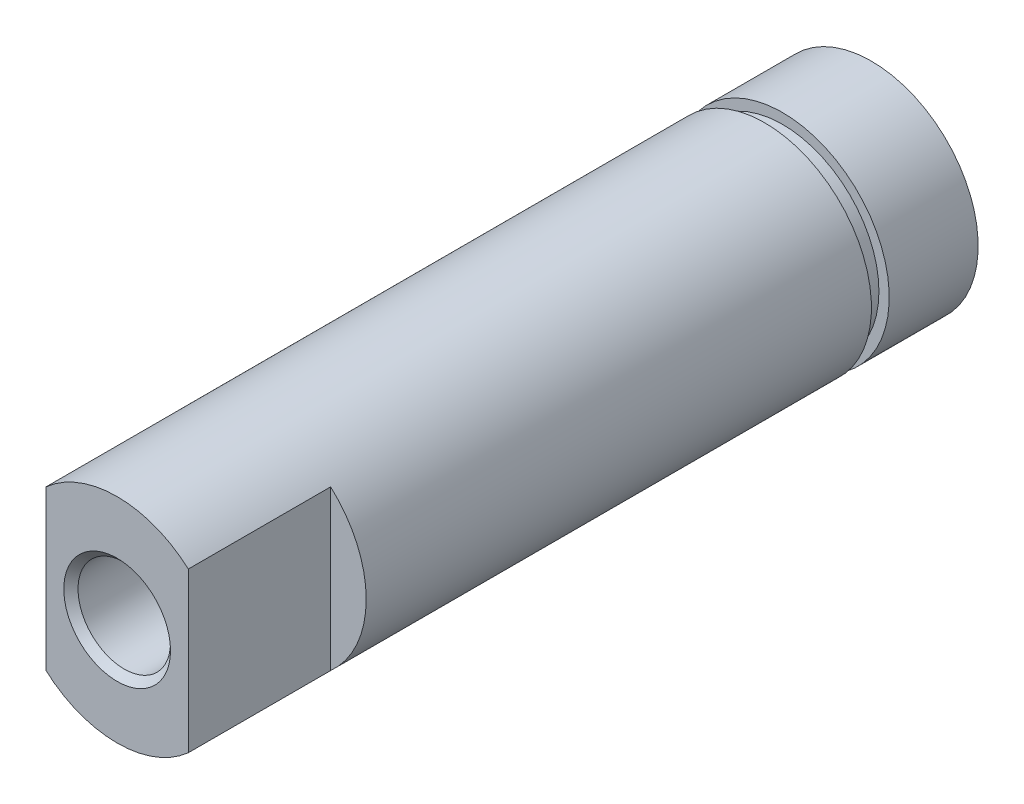
ISO-10303-21;
HEADER;
FILE_DESCRIPTION(('STEP AP214'),'2;1');
FILE_NAME('part.step','',(''),(''),'','','');
FILE_SCHEMA(('AUTOMOTIVE_DESIGN { 1 0 10303 214 1 1 1 1 }'));
ENDSEC;
DATA;
#1=APPLICATION_CONTEXT('core data for automotive mechanical design processes');
#2=APPLICATION_PROTOCOL_DEFINITION('international standard','automotive_design',2000,#1);
#3=PRODUCT_CONTEXT('',#1,'mechanical');
#4=PRODUCT('Part','Part','',(#3));
#5=PRODUCT_RELATED_PRODUCT_CATEGORY('part','',(#4));
#6=PRODUCT_DEFINITION_FORMATION('','',#4);
#7=PRODUCT_DEFINITION_CONTEXT('part definition',#1,'design');
#8=PRODUCT_DEFINITION('design','',#6,#7);
#9=PRODUCT_DEFINITION_SHAPE('','',#8);
#10=(LENGTH_UNIT() NAMED_UNIT(*) SI_UNIT(.MILLI.,.METRE.));
#11=(NAMED_UNIT(*) PLANE_ANGLE_UNIT() SI_UNIT($,.RADIAN.));
#12=(NAMED_UNIT(*) SI_UNIT($,.STERADIAN.) SOLID_ANGLE_UNIT());
#13=UNCERTAINTY_MEASURE_WITH_UNIT(LENGTH_MEASURE(1.E-05),#10,'distance_accuracy_value','');
#14=(GEOMETRIC_REPRESENTATION_CONTEXT(3) GLOBAL_UNCERTAINTY_ASSIGNED_CONTEXT((#13)) GLOBAL_UNIT_ASSIGNED_CONTEXT((#10,
#11,#12)) REPRESENTATION_CONTEXT('',''));
#15=CARTESIAN_POINT('',(0.,0.,0.));
#16=DIRECTION('',(0.,0.,1.));
#17=DIRECTION('',(1.,0.,0.));
#18=AXIS2_PLACEMENT_3D('',#15,#16,#17);
#19=CARTESIAN_POINT('',(0.,0.,2.696832479623));
#20=DIRECTION('',(0.,0.,1.));
#21=DIRECTION('',(1.,0.,0.));
#22=AXIS2_PLACEMENT_3D('',#19,#20,#21);
#23=PLANE('',#22);
#24=CARTESIAN_POINT('',(0.,0.,2.696832479623));
#25=DIRECTION('',(0.,0.,1.));
#26=DIRECTION('',(1.,0.,0.));
#27=AXIS2_PLACEMENT_3D('',#24,#25,#26);
#28=CIRCLE('',#27,2.6);
#29=CARTESIAN_POINT('',(2.6,0.,2.696832479623));
#30=VERTEX_POINT('',#29);
#31=EDGE_CURVE('E37',#30,#30,#28,.F.);
#32=ORIENTED_EDGE('',*,*,#31,.F.);
#33=EDGE_LOOP('',(#32));
#34=FACE_BOUND('',#33,.T.);
#35=ADVANCED_FACE('F34',(#34),#23,.T.);
#36=CARTESIAN_POINT('',(0.,0.,2.696832479623));
#37=DIRECTION('',(0.,0.,1.));
#38=DIRECTION('',(1.,0.,0.));
#39=AXIS2_PLACEMENT_3D('',#36,#37,#38);
#40=CYLINDRICAL_SURFACE('',#39,2.6);
#41=ORIENTED_EDGE('',*,*,#31,.T.);
#42=EDGE_LOOP('',(#41));
#43=FACE_BOUND('',#42,.T.);
#44=CARTESIAN_POINT('',(0.,0.,32.296832479623));
#45=DIRECTION('',(0.,0.,1.));
#46=DIRECTION('',(1.,0.,0.));
#47=AXIS2_PLACEMENT_3D('',#44,#45,#46);
#48=CIRCLE('',#47,2.6);
#49=CARTESIAN_POINT('',(2.6,0.,32.296832479623));
#50=VERTEX_POINT('',#49);
#51=EDGE_CURVE('E111',#50,#50,#48,.F.);
#52=ORIENTED_EDGE('',*,*,#51,.F.);
#53=EDGE_LOOP('',(#52));
#54=FACE_BOUND('',#53,.T.);
#55=ADVANCED_FACE('F241',(#43,#54),#40,.F.);
#56=CARTESIAN_POINT('',(0.,0.,32.296832479623));
#57=DIRECTION('',(0.,0.,1.));
#58=DIRECTION('',(1.,0.,0.));
#59=AXIS2_PLACEMENT_3D('',#56,#57,#58);
#60=CONICAL_SURFACE('',#59,2.6,0.785398163397451);
#61=ORIENTED_EDGE('',*,*,#51,.T.);
#62=EDGE_LOOP('',(#61));
#63=FACE_BOUND('',#62,.T.);
#64=CARTESIAN_POINT('',(0.,0.,32.696832479623));
#65=DIRECTION('',(0.,0.,1.));
#66=DIRECTION('',(1.,0.,0.));
#67=AXIS2_PLACEMENT_3D('',#64,#65,#66);
#68=CIRCLE('',#67,2.99999999999999);
#69=CARTESIAN_POINT('',(2.99999999999999,0.,32.696832479623));
#70=VERTEX_POINT('',#69);
#71=EDGE_CURVE('E80',#70,#70,#68,.F.);
#72=ORIENTED_EDGE('',*,*,#71,.F.);
#73=EDGE_LOOP('',(#72));
#74=FACE_BOUND('',#73,.T.);
#75=ADVANCED_FACE('F233',(#63,#74),#60,.F.);
#76=CARTESIAN_POINT('',(0.,0.,24.696832479623));
#77=DIRECTION('',(0.,0.,1.));
#78=DIRECTION('',(1.,0.,0.));
#79=AXIS2_PLACEMENT_3D('',#76,#77,#78);
#80=PLANE('',#79);
#81=CARTESIAN_POINT('',(0.,0.,24.696832479623));
#82=DIRECTION('',(0.,0.,-1.));
#83=DIRECTION('',(-1.,0.,0.));
#84=AXIS2_PLACEMENT_3D('',#81,#82,#83);
#85=CIRCLE('',#84,6.);
#86=CARTESIAN_POINT('',(4.00000000024835,4.47213595477745,24.696832479623));
#87=VERTEX_POINT('',#86);
#88=CARTESIAN_POINT('',(4.00000000024835,-4.47213595477745,24.696832479623));
#89=VERTEX_POINT('',#88);
#90=EDGE_CURVE('E89',#87,#89,#85,.T.);
#91=ORIENTED_EDGE('',*,*,#90,.F.);
#92=DIRECTION('',(0.,1.,0.));
#93=VECTOR('',#92,1.);
#94=CARTESIAN_POINT('',(4.,5.617404432,24.696832479623));
#95=LINE('',#94,#93);
#96=EDGE_CURVE('E96',#89,#87,#95,.T.);
#97=ORIENTED_EDGE('',*,*,#96,.F.);
#98=EDGE_LOOP('',(#91,#97));
#99=FACE_BOUND('',#98,.T.);
#100=ADVANCED_FACE('F131',(#99),#80,.T.);
#101=CARTESIAN_POINT('',(0.,0.,24.696832479623));
#102=DIRECTION('',(0.,0.,1.));
#103=DIRECTION('',(1.,0.,0.));
#104=AXIS2_PLACEMENT_3D('',#101,#102,#103);
#105=PLANE('',#104);
#106=CARTESIAN_POINT('',(0.,0.,24.696832479623));
#107=DIRECTION('',(0.,0.,-1.));
#108=DIRECTION('',(-1.,0.,0.));
#109=AXIS2_PLACEMENT_3D('',#106,#107,#108);
#110=CIRCLE('',#109,6.);
#111=CARTESIAN_POINT('',(-4.00000000024835,-4.47213595477745,24.696832479623));
#112=VERTEX_POINT('',#111);
#113=CARTESIAN_POINT('',(-4.00000000024835,4.47213595477745,24.696832479623));
#114=VERTEX_POINT('',#113);
#115=EDGE_CURVE('E127',#112,#114,#110,.T.);
#116=ORIENTED_EDGE('',*,*,#115,.F.);
#117=DIRECTION('',(0.,1.,0.));
#118=VECTOR('',#117,1.);
#119=CARTESIAN_POINT('',(-4.,4.472135954,24.696832479623));
#120=LINE('',#119,#118);
#121=EDGE_CURVE('E81',#114,#112,#120,.F.);
#122=ORIENTED_EDGE('',*,*,#121,.F.);
#123=EDGE_LOOP('',(#116,#122));
#124=FACE_BOUND('',#123,.T.);
#125=ADVANCED_FACE('F218',(#124),#105,.T.);
#126=CARTESIAN_POINT('',(-4.,4.472135954,24.696832479623));
#127=DIRECTION('',(1.,0.,0.));
#128=DIRECTION('',(0.,0.,-1.));
#129=AXIS2_PLACEMENT_3D('',#126,#127,#128);
#130=PLANE('',#129);
#131=ORIENTED_EDGE('',*,*,#121,.T.);
#132=DIRECTION('',(0.,0.,-1.));
#133=VECTOR('',#132,1.);
#134=CARTESIAN_POINT('',(-4.00000000049669,-4.47213595455532,14.496832479623));
#135=LINE('',#134,#133);
#136=CARTESIAN_POINT('',(-4.00000000024835,-4.47213595477745,32.696832479623));
#137=VERTEX_POINT('',#136);
#138=EDGE_CURVE('E85',#137,#112,#135,.T.);
#139=ORIENTED_EDGE('',*,*,#138,.F.);
#140=DIRECTION('',(0.,1.,0.));
#141=VECTOR('',#140,1.);
#142=CARTESIAN_POINT('',(-4.,0.,32.696832479623));
#143=LINE('',#142,#141);
#144=CARTESIAN_POINT('',(-4.00000000024835,4.47213595477745,32.696832479623));
#145=VERTEX_POINT('',#144);
#146=EDGE_CURVE('E69',#145,#137,#143,.F.);
#147=ORIENTED_EDGE('',*,*,#146,.F.);
#148=DIRECTION('',(0.,0.,1.));
#149=VECTOR('',#148,1.);
#150=CARTESIAN_POINT('',(-4.0000000004967,4.47213595455532,14.496832479623));
#151=LINE('',#150,#149);
#152=EDGE_CURVE('E126',#114,#145,#151,.T.);
#153=ORIENTED_EDGE('',*,*,#152,.F.);
#154=EDGE_LOOP('',(#131,#139,#147,#153));
#155=FACE_BOUND('',#154,.T.);
#156=ADVANCED_FACE('F86',(#155),#130,.F.);
#157=CARTESIAN_POINT('',(0.,0.,32.696832479623));
#158=DIRECTION('',(0.,0.,1.));
#159=DIRECTION('',(1.,0.,0.));
#160=AXIS2_PLACEMENT_3D('',#157,#158,#159);
#161=PLANE('',#160);
#162=ORIENTED_EDGE('',*,*,#71,.T.);
#163=EDGE_LOOP('',(#162));
#164=FACE_BOUND('',#163,.T.);
#165=ORIENTED_EDGE('',*,*,#146,.T.);
#166=CARTESIAN_POINT('',(0.,0.,32.696832479623));
#167=DIRECTION('',(0.,0.,-1.));
#168=DIRECTION('',(-1.,0.,0.));
#169=AXIS2_PLACEMENT_3D('',#166,#167,#168);
#170=CIRCLE('',#169,6.);
#171=CARTESIAN_POINT('',(4.00000000024835,-4.47213595477745,32.696832479623));
#172=VERTEX_POINT('',#171);
#173=EDGE_CURVE('E73',#172,#137,#170,.T.);
#174=ORIENTED_EDGE('',*,*,#173,.F.);
#175=DIRECTION('',(0.,1.,0.));
#176=VECTOR('',#175,1.);
#177=CARTESIAN_POINT('',(4.,5.617404432,32.696832479623));
#178=LINE('',#177,#176);
#179=CARTESIAN_POINT('',(4.00000000024835,4.47213595477745,32.696832479623));
#180=VERTEX_POINT('',#179);
#181=EDGE_CURVE('E52',#180,#172,#178,.F.);
#182=ORIENTED_EDGE('',*,*,#181,.F.);
#183=CARTESIAN_POINT('',(0.,0.,32.696832479623));
#184=DIRECTION('',(0.,0.,-1.));
#185=DIRECTION('',(-1.,0.,0.));
#186=AXIS2_PLACEMENT_3D('',#183,#184,#185);
#187=CIRCLE('',#186,6.);
#188=EDGE_CURVE('E76',#145,#180,#187,.T.);
#189=ORIENTED_EDGE('',*,*,#188,.F.);
#190=EDGE_LOOP('',(#165,#174,#182,#189));
#191=FACE_BOUND('',#190,.T.);
#192=ADVANCED_FACE('F71',(#164,#191),#161,.T.);
#193=CARTESIAN_POINT('',(4.,5.617404432,24.696832479623));
#194=DIRECTION('',(-1.,0.,0.));
#195=DIRECTION('',(0.,0.,1.));
#196=AXIS2_PLACEMENT_3D('',#193,#194,#195);
#197=PLANE('',#196);
#198=ORIENTED_EDGE('',*,*,#96,.T.);
#199=DIRECTION('',(0.,0.,-1.));
#200=VECTOR('',#199,1.);
#201=CARTESIAN_POINT('',(4.00000000049669,4.47213595455532,14.496832479623));
#202=LINE('',#201,#200);
#203=EDGE_CURVE('E109',#180,#87,#202,.T.);
#204=ORIENTED_EDGE('',*,*,#203,.F.);
#205=ORIENTED_EDGE('',*,*,#181,.T.);
#206=DIRECTION('',(0.,0.,1.));
#207=VECTOR('',#206,1.);
#208=CARTESIAN_POINT('',(4.0000000004967,-4.47213595455532,14.496832479623));
#209=LINE('',#208,#207);
#210=EDGE_CURVE('E94',#89,#172,#209,.T.);
#211=ORIENTED_EDGE('',*,*,#210,.F.);
#212=EDGE_LOOP('',(#198,#204,#205,#211));
#213=FACE_BOUND('',#212,.T.);
#214=ADVANCED_FACE('F132',(#213),#197,.F.);
#215=CARTESIAN_POINT('',(0.,0.,-3.70316752037701));
#216=DIRECTION('',(0.,0.,-1.));
#217=DIRECTION('',(-1.,0.,0.));
#218=AXIS2_PLACEMENT_3D('',#215,#216,#217);
#219=CYLINDRICAL_SURFACE('',#218,6.);
#220=CARTESIAN_POINT('',(0.,0.,-3.70316752037701));
#221=DIRECTION('',(0.,0.,-1.));
#222=DIRECTION('',(-1.,0.,0.));
#223=AXIS2_PLACEMENT_3D('',#220,#221,#222);
#224=CIRCLE('',#223,6.);
#225=CARTESIAN_POINT('',(-6.,0.,-3.70316752037701));
#226=VERTEX_POINT('',#225);
#227=EDGE_CURVE('E123',#226,#226,#224,.T.);
#228=ORIENTED_EDGE('',*,*,#227,.F.);
#229=EDGE_LOOP('',(#228));
#230=FACE_BOUND('',#229,.T.);
#231=ORIENTED_EDGE('',*,*,#188,.T.);
#232=ORIENTED_EDGE('',*,*,#203,.T.);
#233=ORIENTED_EDGE('',*,*,#90,.T.);
#234=ORIENTED_EDGE('',*,*,#210,.T.);
#235=ORIENTED_EDGE('',*,*,#173,.T.);
#236=ORIENTED_EDGE('',*,*,#138,.T.);
#237=ORIENTED_EDGE('',*,*,#115,.T.);
#238=ORIENTED_EDGE('',*,*,#152,.T.);
#239=EDGE_LOOP('',(#231,#232,#233,#234,#235,#236,#237,#238));
#240=FACE_BOUND('',#239,.T.);
#241=ADVANCED_FACE('F91',(#230,#240),#219,.T.);
#242=CARTESIAN_POINT('',(0.,6.,-3.70316752037701));
#243=DIRECTION('',(0.,0.,-1.));
#244=DIRECTION('',(-1.,0.,0.));
#245=AXIS2_PLACEMENT_3D('',#242,#243,#244);
#246=PLANE('',#245);
#247=CARTESIAN_POINT('',(0.,0.,-3.70316752037701));
#248=DIRECTION('',(0.,0.,1.));
#249=DIRECTION('',(1.,0.,0.));
#250=AXIS2_PLACEMENT_3D('',#247,#248,#249);
#251=CIRCLE('',#250,5.422122684);
#252=CARTESIAN_POINT('',(5.422122684,0.,-3.70316752037701));
#253=VERTEX_POINT('',#252);
#254=EDGE_CURVE('E120',#253,#253,#251,.F.);
#255=ORIENTED_EDGE('',*,*,#254,.F.);
#256=EDGE_LOOP('',(#255));
#257=FACE_BOUND('',#256,.T.);
#258=ORIENTED_EDGE('',*,*,#227,.T.);
#259=EDGE_LOOP('',(#258));
#260=FACE_BOUND('',#259,.T.);
#261=ADVANCED_FACE('F139',(#257,#260),#246,.T.);
#262=CARTESIAN_POINT('',(0.,0.,-3.70316752037701));
#263=DIRECTION('',(0.,0.,1.));
#264=DIRECTION('',(1.,0.,0.));
#265=AXIS2_PLACEMENT_3D('',#262,#263,#264);
#266=CYLINDRICAL_SURFACE('',#265,5.422122684);
#267=CARTESIAN_POINT('',(0.,0.,-4.70316752037701));
#268=DIRECTION('',(0.,0.,1.));
#269=DIRECTION('',(1.,0.,0.));
#270=AXIS2_PLACEMENT_3D('',#267,#268,#269);
#271=CIRCLE('',#270,5.422122684);
#272=CARTESIAN_POINT('',(5.422122684,0.,-4.70316752037701));
#273=VERTEX_POINT('',#272);
#274=EDGE_CURVE('E117',#273,#273,#271,.F.);
#275=ORIENTED_EDGE('',*,*,#274,.F.);
#276=EDGE_LOOP('',(#275));
#277=FACE_BOUND('',#276,.T.);
#278=ORIENTED_EDGE('',*,*,#254,.T.);
#279=EDGE_LOOP('',(#278));
#280=FACE_BOUND('',#279,.T.);
#281=ADVANCED_FACE('F158',(#277,#280),#266,.T.);
#282=CARTESIAN_POINT('',(0.,6.,-4.70316752037701));
#283=DIRECTION('',(0.,0.,1.));
#284=DIRECTION('',(1.,0.,0.));
#285=AXIS2_PLACEMENT_3D('',#282,#283,#284);
#286=PLANE('',#285);
#287=ORIENTED_EDGE('',*,*,#274,.T.);
#288=EDGE_LOOP('',(#287));
#289=FACE_BOUND('',#288,.T.);
#290=CARTESIAN_POINT('',(0.,0.,-4.70316752037701));
#291=DIRECTION('',(0.,0.,-1.));
#292=DIRECTION('',(-1.,0.,0.));
#293=AXIS2_PLACEMENT_3D('',#290,#291,#292);
#294=CIRCLE('',#293,6.);
#295=CARTESIAN_POINT('',(-6.,0.,-4.70316752037701));
#296=VERTEX_POINT('',#295);
#297=EDGE_CURVE('E43',#296,#296,#294,.T.);
#298=ORIENTED_EDGE('',*,*,#297,.F.);
#299=EDGE_LOOP('',(#298));
#300=FACE_BOUND('',#299,.T.);
#301=ADVANCED_FACE('F151',(#289,#300),#286,.T.);
#302=CARTESIAN_POINT('',(0.,0.,-9.70316752037701));
#303=DIRECTION('',(0.,0.,1.));
#304=DIRECTION('',(1.,0.,0.));
#305=AXIS2_PLACEMENT_3D('',#302,#303,#304);
#306=PLANE('',#305);
#307=CARTESIAN_POINT('',(0.,0.,-9.70316752037701));
#308=DIRECTION('',(0.,0.,-1.));
#309=DIRECTION('',(-1.,0.,0.));
#310=AXIS2_PLACEMENT_3D('',#307,#308,#309);
#311=CIRCLE('',#310,6.);
#312=CARTESIAN_POINT('',(-6.,0.,-9.70316752037701));
#313=VERTEX_POINT('',#312);
#314=EDGE_CURVE('E11',#313,#313,#311,.F.);
#315=ORIENTED_EDGE('',*,*,#314,.F.);
#316=EDGE_LOOP('',(#315));
#317=FACE_BOUND('',#316,.T.);
#318=ADVANCED_FACE('F145',(#317),#306,.F.);
#319=CARTESIAN_POINT('',(0.,0.,-9.70316752037701));
#320=DIRECTION('',(0.,0.,-1.));
#321=DIRECTION('',(-1.,0.,0.));
#322=AXIS2_PLACEMENT_3D('',#319,#320,#321);
#323=CYLINDRICAL_SURFACE('',#322,6.);
#324=ORIENTED_EDGE('',*,*,#314,.T.);
#325=EDGE_LOOP('',(#324));
#326=FACE_BOUND('',#325,.T.);
#327=ORIENTED_EDGE('',*,*,#297,.T.);
#328=EDGE_LOOP('',(#327));
#329=FACE_BOUND('',#328,.T.);
#330=ADVANCED_FACE('F143',(#326,#329),#323,.T.);
#331=CLOSED_SHELL('',(#35,#55,#75,#100,#125,#156,#192,#214,#241,#261,#281,#301,#318,#330));
#332=MANIFOLD_SOLID_BREP('B2',#331);
#333=ADVANCED_BREP_SHAPE_REPRESENTATION('',(#18,#332),#14);
#334=SHAPE_DEFINITION_REPRESENTATION(#9,#333);
ENDSEC;
END-ISO-10303-21;
